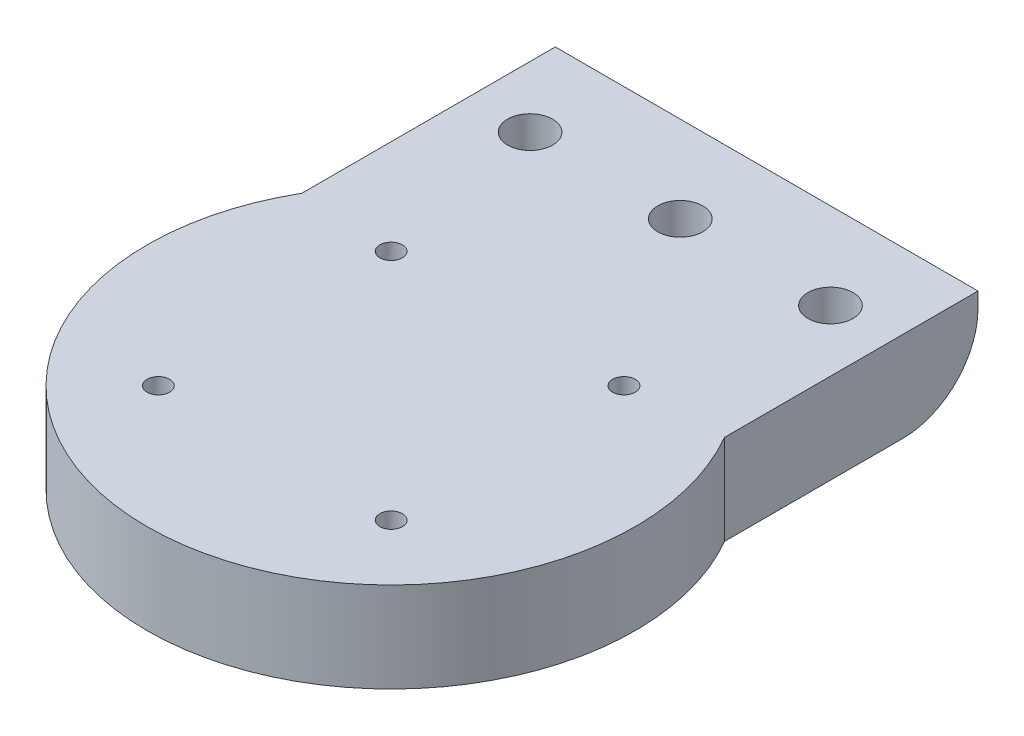
ISO-10303-21;
HEADER;
FILE_DESCRIPTION(('STEP AP214'),'2;1');
FILE_NAME('part.step','',(''),(''),'','','');
FILE_SCHEMA(('AUTOMOTIVE_DESIGN { 1 0 10303 214 1 1 1 1 }'));
ENDSEC;
DATA;
#1=APPLICATION_CONTEXT('core data for automotive mechanical design processes');
#2=APPLICATION_PROTOCOL_DEFINITION('international standard','automotive_design',2000,#1);
#3=PRODUCT_CONTEXT('',#1,'mechanical');
#4=PRODUCT('Part','Part','',(#3));
#5=PRODUCT_RELATED_PRODUCT_CATEGORY('part','',(#4));
#6=PRODUCT_DEFINITION_FORMATION('','',#4);
#7=PRODUCT_DEFINITION_CONTEXT('part definition',#1,'design');
#8=PRODUCT_DEFINITION('design','',#6,#7);
#9=PRODUCT_DEFINITION_SHAPE('','',#8);
#10=(LENGTH_UNIT() NAMED_UNIT(*) SI_UNIT(.MILLI.,.METRE.));
#11=(NAMED_UNIT(*) PLANE_ANGLE_UNIT() SI_UNIT($,.RADIAN.));
#12=(NAMED_UNIT(*) SI_UNIT($,.STERADIAN.) SOLID_ANGLE_UNIT());
#13=UNCERTAINTY_MEASURE_WITH_UNIT(LENGTH_MEASURE(1.E-05),#10,'distance_accuracy_value','');
#14=(GEOMETRIC_REPRESENTATION_CONTEXT(3) GLOBAL_UNCERTAINTY_ASSIGNED_CONTEXT((#13)) GLOBAL_UNIT_ASSIGNED_CONTEXT((#10,
#11,#12)) REPRESENTATION_CONTEXT('',''));
#15=CARTESIAN_POINT('',(0.,0.,0.));
#16=DIRECTION('',(0.,0.,1.));
#17=DIRECTION('',(1.,0.,0.));
#18=AXIS2_PLACEMENT_3D('',#15,#16,#17);
#19=CARTESIAN_POINT('',(0.,12.,0.));
#20=DIRECTION('',(0.,-1.,0.));
#21=DIRECTION('',(0.,0.,-1.));
#22=AXIS2_PLACEMENT_3D('',#19,#20,#21);
#23=CYLINDRICAL_SURFACE('',#22,32.5);
#24=DIRECTION('',(0.,1.,0.));
#25=VECTOR('',#24,1.);
#26=CARTESIAN_POINT('',(28.1458256229942,0.,-16.25));
#27=LINE('',#26,#25);
#28=CARTESIAN_POINT('',(28.1458256229942,0.,-16.25));
#29=VERTEX_POINT('',#28);
#30=CARTESIAN_POINT('',(28.1458256229942,12.,-16.25));
#31=VERTEX_POINT('',#30);
#32=EDGE_CURVE('E135',#29,#31,#27,.T.);
#33=ORIENTED_EDGE('',*,*,#32,.T.);
#34=CARTESIAN_POINT('',(0.,12.,0.));
#35=DIRECTION('',(0.,1.,0.));
#36=DIRECTION('',(0.,0.,1.));
#37=AXIS2_PLACEMENT_3D('',#34,#35,#36);
#38=CIRCLE('',#37,32.5);
#39=CARTESIAN_POINT('',(-28.1458256229944,12.,-16.2499999999998));
#40=VERTEX_POINT('',#39);
#41=EDGE_CURVE('E133',#40,#31,#38,.T.);
#42=ORIENTED_EDGE('',*,*,#41,.F.);
#43=DIRECTION('',(0.,1.,0.));
#44=VECTOR('',#43,1.);
#45=CARTESIAN_POINT('',(-28.1458256229944,0.,-16.2499999999998));
#46=LINE('',#45,#44);
#47=CARTESIAN_POINT('',(-28.1458256229944,0.,-16.2499999999998));
#48=VERTEX_POINT('',#47);
#49=EDGE_CURVE('E114',#48,#40,#46,.T.);
#50=ORIENTED_EDGE('',*,*,#49,.F.);
#51=CARTESIAN_POINT('',(0.,0.,0.));
#52=DIRECTION('',(0.,1.,0.));
#53=DIRECTION('',(0.,0.,1.));
#54=AXIS2_PLACEMENT_3D('',#51,#52,#53);
#55=CIRCLE('',#54,32.5);
#56=EDGE_CURVE('E123',#48,#29,#55,.T.);
#57=ORIENTED_EDGE('',*,*,#56,.T.);
#58=EDGE_LOOP('',(#33,#42,#50,#57));
#59=FACE_BOUND('',#58,.T.);
#60=ADVANCED_FACE('F41',(#59),#23,.T.);
#61=CARTESIAN_POINT('',(15.5,12.,15.5));
#62=DIRECTION('',(0.,-1.,0.));
#63=DIRECTION('',(0.,0.,-1.));
#64=AXIS2_PLACEMENT_3D('',#61,#62,#63);
#65=CYLINDRICAL_SURFACE('',#64,1.5);
#66=CARTESIAN_POINT('',(15.5,12.,15.5));
#67=DIRECTION('',(0.,1.,0.));
#68=DIRECTION('',(0.,0.,1.));
#69=AXIS2_PLACEMENT_3D('',#66,#67,#68);
#70=CIRCLE('',#69,1.5);
#71=CARTESIAN_POINT('',(15.5,12.,17.));
#72=VERTEX_POINT('',#71);
#73=EDGE_CURVE('E161',#72,#72,#70,.T.);
#74=ORIENTED_EDGE('',*,*,#73,.T.);
#75=EDGE_LOOP('',(#74));
#76=FACE_BOUND('',#75,.T.);
#77=CARTESIAN_POINT('',(15.5,0.,15.5));
#78=DIRECTION('',(0.,1.,0.));
#79=DIRECTION('',(0.,0.,1.));
#80=AXIS2_PLACEMENT_3D('',#77,#78,#79);
#81=CIRCLE('',#80,1.5);
#82=CARTESIAN_POINT('',(15.5,0.,17.));
#83=VERTEX_POINT('',#82);
#84=EDGE_CURVE('E130',#83,#83,#81,.T.);
#85=ORIENTED_EDGE('',*,*,#84,.F.);
#86=EDGE_LOOP('',(#85));
#87=FACE_BOUND('',#86,.T.);
#88=ADVANCED_FACE('F309',(#76,#87),#65,.F.);
#89=CARTESIAN_POINT('',(15.5,12.,-15.5));
#90=DIRECTION('',(0.,-1.,0.));
#91=DIRECTION('',(0.,0.,-1.));
#92=AXIS2_PLACEMENT_3D('',#89,#90,#91);
#93=CYLINDRICAL_SURFACE('',#92,1.5);
#94=CARTESIAN_POINT('',(15.5,12.,-15.5));
#95=DIRECTION('',(0.,1.,0.));
#96=DIRECTION('',(0.,0.,1.));
#97=AXIS2_PLACEMENT_3D('',#94,#95,#96);
#98=CIRCLE('',#97,1.5);
#99=CARTESIAN_POINT('',(15.5,12.,-14.));
#100=VERTEX_POINT('',#99);
#101=EDGE_CURVE('E157',#100,#100,#98,.T.);
#102=ORIENTED_EDGE('',*,*,#101,.T.);
#103=EDGE_LOOP('',(#102));
#104=FACE_BOUND('',#103,.T.);
#105=CARTESIAN_POINT('',(15.5,0.,-15.5));
#106=DIRECTION('',(0.,1.,0.));
#107=DIRECTION('',(0.,0.,1.));
#108=AXIS2_PLACEMENT_3D('',#105,#106,#107);
#109=CIRCLE('',#108,1.5);
#110=CARTESIAN_POINT('',(15.5,0.,-14.));
#111=VERTEX_POINT('',#110);
#112=EDGE_CURVE('E175',#111,#111,#109,.T.);
#113=ORIENTED_EDGE('',*,*,#112,.F.);
#114=EDGE_LOOP('',(#113));
#115=FACE_BOUND('',#114,.T.);
#116=ADVANCED_FACE('F312',(#104,#115),#93,.F.);
#117=CARTESIAN_POINT('',(-15.5,12.,-15.5));
#118=DIRECTION('',(0.,-1.,0.));
#119=DIRECTION('',(0.,0.,-1.));
#120=AXIS2_PLACEMENT_3D('',#117,#118,#119);
#121=CYLINDRICAL_SURFACE('',#120,1.5);
#122=CARTESIAN_POINT('',(-15.5,12.,-15.5));
#123=DIRECTION('',(0.,1.,0.));
#124=DIRECTION('',(0.,0.,1.));
#125=AXIS2_PLACEMENT_3D('',#122,#123,#124);
#126=CIRCLE('',#125,1.5);
#127=CARTESIAN_POINT('',(-15.5,12.,-14.));
#128=VERTEX_POINT('',#127);
#129=EDGE_CURVE('E153',#128,#128,#126,.T.);
#130=ORIENTED_EDGE('',*,*,#129,.T.);
#131=EDGE_LOOP('',(#130));
#132=FACE_BOUND('',#131,.T.);
#133=CARTESIAN_POINT('',(-15.5,0.,-15.5));
#134=DIRECTION('',(0.,1.,0.));
#135=DIRECTION('',(0.,0.,1.));
#136=AXIS2_PLACEMENT_3D('',#133,#134,#135);
#137=CIRCLE('',#136,1.5);
#138=CARTESIAN_POINT('',(-15.5,0.,-14.));
#139=VERTEX_POINT('',#138);
#140=EDGE_CURVE('E171',#139,#139,#137,.T.);
#141=ORIENTED_EDGE('',*,*,#140,.F.);
#142=EDGE_LOOP('',(#141));
#143=FACE_BOUND('',#142,.T.);
#144=ADVANCED_FACE('F332',(#132,#143),#121,.F.);
#145=CARTESIAN_POINT('',(-15.5,12.,15.5));
#146=DIRECTION('',(0.,-1.,0.));
#147=DIRECTION('',(0.,0.,-1.));
#148=AXIS2_PLACEMENT_3D('',#145,#146,#147);
#149=CYLINDRICAL_SURFACE('',#148,1.5);
#150=CARTESIAN_POINT('',(-15.5,12.,15.5));
#151=DIRECTION('',(0.,1.,0.));
#152=DIRECTION('',(0.,0.,1.));
#153=AXIS2_PLACEMENT_3D('',#150,#151,#152);
#154=CIRCLE('',#153,1.5);
#155=CARTESIAN_POINT('',(-15.5,12.,17.));
#156=VERTEX_POINT('',#155);
#157=EDGE_CURVE('E129',#156,#156,#154,.T.);
#158=ORIENTED_EDGE('',*,*,#157,.T.);
#159=EDGE_LOOP('',(#158));
#160=FACE_BOUND('',#159,.T.);
#161=CARTESIAN_POINT('',(-15.5,0.,15.5));
#162=DIRECTION('',(0.,1.,0.));
#163=DIRECTION('',(0.,0.,1.));
#164=AXIS2_PLACEMENT_3D('',#161,#162,#163);
#165=CIRCLE('',#164,1.5);
#166=CARTESIAN_POINT('',(-15.5,0.,17.));
#167=VERTEX_POINT('',#166);
#168=EDGE_CURVE('E149',#167,#167,#165,.T.);
#169=ORIENTED_EDGE('',*,*,#168,.F.);
#170=EDGE_LOOP('',(#169));
#171=FACE_BOUND('',#170,.T.);
#172=ADVANCED_FACE('F294',(#160,#171),#149,.F.);
#173=CARTESIAN_POINT('',(0.,12.,0.));
#174=DIRECTION('',(0.,1.,0.));
#175=DIRECTION('',(0.,0.,1.));
#176=AXIS2_PLACEMENT_3D('',#173,#174,#175);
#177=PLANE('',#176);
#178=CARTESIAN_POINT('',(-20.,12.,-38.5));
#179=DIRECTION('',(0.,1.,0.));
#180=DIRECTION('',(0.,0.,1.));
#181=AXIS2_PLACEMENT_3D('',#178,#179,#180);
#182=CIRCLE('',#181,3.);
#183=CARTESIAN_POINT('',(-20.,12.,-35.5));
#184=VERTEX_POINT('',#183);
#185=EDGE_CURVE('E246',#184,#184,#182,.T.);
#186=ORIENTED_EDGE('',*,*,#185,.F.);
#187=EDGE_LOOP('',(#186));
#188=FACE_BOUND('',#187,.T.);
#189=CARTESIAN_POINT('',(0.,12.,-38.5));
#190=DIRECTION('',(0.,1.,0.));
#191=DIRECTION('',(0.,0.,1.));
#192=AXIS2_PLACEMENT_3D('',#189,#190,#191);
#193=CIRCLE('',#192,3.);
#194=CARTESIAN_POINT('',(0.,12.,-35.5));
#195=VERTEX_POINT('',#194);
#196=EDGE_CURVE('E247',#195,#195,#193,.T.);
#197=ORIENTED_EDGE('',*,*,#196,.F.);
#198=EDGE_LOOP('',(#197));
#199=FACE_BOUND('',#198,.T.);
#200=CARTESIAN_POINT('',(20.,12.,-38.5));
#201=DIRECTION('',(0.,1.,0.));
#202=DIRECTION('',(0.,0.,1.));
#203=AXIS2_PLACEMENT_3D('',#200,#201,#202);
#204=CIRCLE('',#203,3.);
#205=CARTESIAN_POINT('',(20.,12.,-35.5));
#206=VERTEX_POINT('',#205);
#207=EDGE_CURVE('E273',#206,#206,#204,.T.);
#208=ORIENTED_EDGE('',*,*,#207,.F.);
#209=EDGE_LOOP('',(#208));
#210=FACE_BOUND('',#209,.T.);
#211=ORIENTED_EDGE('',*,*,#157,.F.);
#212=EDGE_LOOP('',(#211));
#213=FACE_BOUND('',#212,.T.);
#214=ORIENTED_EDGE('',*,*,#129,.F.);
#215=EDGE_LOOP('',(#214));
#216=FACE_BOUND('',#215,.T.);
#217=ORIENTED_EDGE('',*,*,#101,.F.);
#218=EDGE_LOOP('',(#217));
#219=FACE_BOUND('',#218,.T.);
#220=ORIENTED_EDGE('',*,*,#73,.F.);
#221=EDGE_LOOP('',(#220));
#222=FACE_BOUND('',#221,.T.);
#223=ORIENTED_EDGE('',*,*,#41,.T.);
#224=DIRECTION('',(0.,0.,1.));
#225=VECTOR('',#224,1.);
#226=CARTESIAN_POINT('',(28.1458256229942,12.,0.));
#227=LINE('',#226,#225);
#228=CARTESIAN_POINT('',(28.1458256229942,12.,-50.));
#229=VERTEX_POINT('',#228);
#230=EDGE_CURVE('E120',#229,#31,#227,.T.);
#231=ORIENTED_EDGE('',*,*,#230,.F.);
#232=DIRECTION('',(-1.,0.,0.));
#233=VECTOR('',#232,1.);
#234=CARTESIAN_POINT('',(0.,12.,-50.));
#235=LINE('',#234,#233);
#236=CARTESIAN_POINT('',(-28.1458256229944,12.,-50.));
#237=VERTEX_POINT('',#236);
#238=EDGE_CURVE('E260',#229,#237,#235,.T.);
#239=ORIENTED_EDGE('',*,*,#238,.T.);
#240=DIRECTION('',(0.,0.,1.));
#241=VECTOR('',#240,1.);
#242=CARTESIAN_POINT('',(-28.1458256229944,12.,0.));
#243=LINE('',#242,#241);
#244=EDGE_CURVE('E265',#237,#40,#243,.T.);
#245=ORIENTED_EDGE('',*,*,#244,.T.);
#246=EDGE_LOOP('',(#223,#231,#239,#245));
#247=FACE_BOUND('',#246,.T.);
#248=ADVANCED_FACE('F291',(#188,#199,#210,#213,#216,#219,#222,#247),#177,.T.);
#249=CARTESIAN_POINT('',(0.,0.,0.));
#250=DIRECTION('',(0.,1.,0.));
#251=DIRECTION('',(0.,0.,1.));
#252=AXIS2_PLACEMENT_3D('',#249,#250,#251);
#253=PLANE('',#252);
#254=DIRECTION('',(0.,0.,1.));
#255=VECTOR('',#254,1.);
#256=CARTESIAN_POINT('',(-28.1458256229944,0.,0.));
#257=LINE('',#256,#255);
#258=CARTESIAN_POINT('',(-28.1458256229944,0.,-40.));
#259=VERTEX_POINT('',#258);
#260=EDGE_CURVE('E108',#259,#48,#257,.T.);
#261=ORIENTED_EDGE('',*,*,#260,.F.);
#262=DIRECTION('',(-1.,0.,0.));
#263=VECTOR('',#262,1.);
#264=CARTESIAN_POINT('',(28.1458256229942,0.,-40.));
#265=LINE('',#264,#263);
#266=CARTESIAN_POINT('',(-22.5980762113533,0.,-40.));
#267=VERTEX_POINT('',#266);
#268=EDGE_CURVE('E198',#259,#267,#265,.F.);
#269=ORIENTED_EDGE('',*,*,#268,.T.);
#270=CARTESIAN_POINT('',(-20.,0.,-38.5));
#271=DIRECTION('',(0.,1.,0.));
#272=DIRECTION('',(0.,0.,1.));
#273=AXIS2_PLACEMENT_3D('',#270,#271,#272);
#274=CIRCLE('',#273,3.);
#275=CARTESIAN_POINT('',(-17.4019237886467,0.,-40.));
#276=VERTEX_POINT('',#275);
#277=EDGE_CURVE('E270',#267,#276,#274,.T.);
#278=ORIENTED_EDGE('',*,*,#277,.T.);
#279=DIRECTION('',(-1.,0.,0.));
#280=VECTOR('',#279,1.);
#281=CARTESIAN_POINT('',(28.1458256229942,0.,-40.));
#282=LINE('',#281,#280);
#283=CARTESIAN_POINT('',(-2.59807621135335,0.,-40.));
#284=VERTEX_POINT('',#283);
#285=EDGE_CURVE('E195',#276,#284,#282,.F.);
#286=ORIENTED_EDGE('',*,*,#285,.T.);
#287=CARTESIAN_POINT('',(0.,0.,-38.5));
#288=DIRECTION('',(0.,1.,0.));
#289=DIRECTION('',(0.,0.,1.));
#290=AXIS2_PLACEMENT_3D('',#287,#288,#289);
#291=CIRCLE('',#290,3.);
#292=CARTESIAN_POINT('',(2.59807621135329,0.,-40.));
#293=VERTEX_POINT('',#292);
#294=EDGE_CURVE('E241',#284,#293,#291,.T.);
#295=ORIENTED_EDGE('',*,*,#294,.T.);
#296=DIRECTION('',(-1.,0.,0.));
#297=VECTOR('',#296,1.);
#298=CARTESIAN_POINT('',(28.1458256229942,0.,-40.));
#299=LINE('',#298,#297);
#300=CARTESIAN_POINT('',(17.4019237886467,0.,-40.));
#301=VERTEX_POINT('',#300);
#302=EDGE_CURVE('E64',#293,#301,#299,.F.);
#303=ORIENTED_EDGE('',*,*,#302,.T.);
#304=CARTESIAN_POINT('',(20.,0.,-38.5));
#305=DIRECTION('',(0.,1.,0.));
#306=DIRECTION('',(0.,0.,1.));
#307=AXIS2_PLACEMENT_3D('',#304,#305,#306);
#308=CIRCLE('',#307,3.);
#309=CARTESIAN_POINT('',(22.5980762113533,0.,-40.));
#310=VERTEX_POINT('',#309);
#311=EDGE_CURVE('E277',#301,#310,#308,.T.);
#312=ORIENTED_EDGE('',*,*,#311,.T.);
#313=DIRECTION('',(-1.,0.,0.));
#314=VECTOR('',#313,1.);
#315=CARTESIAN_POINT('',(28.1458256229942,0.,-40.));
#316=LINE('',#315,#314);
#317=CARTESIAN_POINT('',(28.1458256229942,0.,-40.));
#318=VERTEX_POINT('',#317);
#319=EDGE_CURVE('E58',#310,#318,#316,.F.);
#320=ORIENTED_EDGE('',*,*,#319,.T.);
#321=DIRECTION('',(0.,0.,1.));
#322=VECTOR('',#321,1.);
#323=CARTESIAN_POINT('',(28.1458256229942,0.,0.));
#324=LINE('',#323,#322);
#325=EDGE_CURVE('E119',#318,#29,#324,.T.);
#326=ORIENTED_EDGE('',*,*,#325,.T.);
#327=ORIENTED_EDGE('',*,*,#56,.F.);
#328=EDGE_LOOP('',(#261,#269,#278,#286,#295,#303,#312,#320,#326,#327));
#329=FACE_BOUND('',#328,.T.);
#330=CARTESIAN_POINT('',(0.,0.,0.));
#331=DIRECTION('',(0.,1.,0.));
#332=DIRECTION('',(0.,0.,1.));
#333=AXIS2_PLACEMENT_3D('',#330,#331,#332);
#334=CIRCLE('',#333,5.);
#335=CARTESIAN_POINT('',(0.,0.,5.));
#336=VERTEX_POINT('',#335);
#337=EDGE_CURVE('E167',#336,#336,#334,.F.);
#338=ORIENTED_EDGE('',*,*,#337,.F.);
#339=EDGE_LOOP('',(#338));
#340=FACE_BOUND('',#339,.T.);
#341=ORIENTED_EDGE('',*,*,#168,.T.);
#342=EDGE_LOOP('',(#341));
#343=FACE_BOUND('',#342,.T.);
#344=ORIENTED_EDGE('',*,*,#140,.T.);
#345=EDGE_LOOP('',(#344));
#346=FACE_BOUND('',#345,.T.);
#347=ORIENTED_EDGE('',*,*,#112,.T.);
#348=EDGE_LOOP('',(#347));
#349=FACE_BOUND('',#348,.T.);
#350=ORIENTED_EDGE('',*,*,#84,.T.);
#351=EDGE_LOOP('',(#350));
#352=FACE_BOUND('',#351,.T.);
#353=ADVANCED_FACE('F124',(#329,#340,#343,#346,#349,#352),#253,.F.);
#354=CARTESIAN_POINT('',(0.,-12.,0.));
#355=DIRECTION('',(0.,1.,0.));
#356=DIRECTION('',(0.,0.,1.));
#357=AXIS2_PLACEMENT_3D('',#354,#355,#356);
#358=CYLINDRICAL_SURFACE('',#357,5.);
#359=CARTESIAN_POINT('',(0.,-12.,0.));
#360=DIRECTION('',(0.,-1.,0.));
#361=DIRECTION('',(0.,0.,-1.));
#362=AXIS2_PLACEMENT_3D('',#359,#360,#361);
#363=CIRCLE('',#362,5.);
#364=CARTESIAN_POINT('',(0.,-12.,-5.));
#365=VERTEX_POINT('',#364);
#366=EDGE_CURVE('E145',#365,#365,#363,.T.);
#367=ORIENTED_EDGE('',*,*,#366,.F.);
#368=EDGE_LOOP('',(#367));
#369=FACE_BOUND('',#368,.T.);
#370=ORIENTED_EDGE('',*,*,#337,.T.);
#371=EDGE_LOOP('',(#370));
#372=FACE_BOUND('',#371,.T.);
#373=ADVANCED_FACE('F317',(#369,#372),#358,.T.);
#374=CARTESIAN_POINT('',(0.,-12.,0.));
#375=DIRECTION('',(0.,-1.,0.));
#376=DIRECTION('',(0.,0.,-1.));
#377=AXIS2_PLACEMENT_3D('',#374,#375,#376);
#378=PLANE('',#377);
#379=ORIENTED_EDGE('',*,*,#366,.T.);
#380=EDGE_LOOP('',(#379));
#381=FACE_BOUND('',#380,.T.);
#382=ADVANCED_FACE('F322',(#381),#378,.T.);
#383=CARTESIAN_POINT('',(0.,0.,-50.));
#384=DIRECTION('',(0.,0.,-1.));
#385=DIRECTION('',(-1.,0.,0.));
#386=AXIS2_PLACEMENT_3D('',#383,#384,#385);
#387=PLANE('',#386);
#388=DIRECTION('',(0.,1.,0.));
#389=VECTOR('',#388,1.);
#390=CARTESIAN_POINT('',(28.1458256229942,0.,-50.));
#391=LINE('',#390,#389);
#392=CARTESIAN_POINT('',(28.1458256229942,10.,-50.));
#393=VERTEX_POINT('',#392);
#394=EDGE_CURVE('E140',#393,#229,#391,.T.);
#395=ORIENTED_EDGE('',*,*,#394,.F.);
#396=DIRECTION('',(-1.,0.,0.));
#397=VECTOR('',#396,1.);
#398=CARTESIAN_POINT('',(-28.1458256229944,10.,-50.));
#399=LINE('',#398,#397);
#400=CARTESIAN_POINT('',(-28.1458256229944,10.,-50.));
#401=VERTEX_POINT('',#400);
#402=EDGE_CURVE('E185',#393,#401,#399,.T.);
#403=ORIENTED_EDGE('',*,*,#402,.T.);
#404=DIRECTION('',(0.,1.,0.));
#405=VECTOR('',#404,1.);
#406=CARTESIAN_POINT('',(-28.1458256229944,0.,-50.));
#407=LINE('',#406,#405);
#408=EDGE_CURVE('E136',#401,#237,#407,.T.);
#409=ORIENTED_EDGE('',*,*,#408,.T.);
#410=ORIENTED_EDGE('',*,*,#238,.F.);
#411=EDGE_LOOP('',(#395,#403,#409,#410));
#412=FACE_BOUND('',#411,.T.);
#413=ADVANCED_FACE('F258',(#412),#387,.T.);
#414=CARTESIAN_POINT('',(28.1458256229942,0.,0.));
#415=DIRECTION('',(-1.,0.,0.));
#416=DIRECTION('',(0.,0.,1.));
#417=AXIS2_PLACEMENT_3D('',#414,#415,#416);
#418=PLANE('',#417);
#419=ORIENTED_EDGE('',*,*,#325,.F.);
#420=CARTESIAN_POINT('',(28.1458256229942,10.,-40.));
#421=DIRECTION('',(-1.,0.,0.));
#422=DIRECTION('',(0.,0.,1.));
#423=AXIS2_PLACEMENT_3D('',#420,#421,#422);
#424=CIRCLE('',#423,10.);
#425=EDGE_CURVE('E11',#318,#393,#424,.F.);
#426=ORIENTED_EDGE('',*,*,#425,.T.);
#427=ORIENTED_EDGE('',*,*,#394,.T.);
#428=ORIENTED_EDGE('',*,*,#230,.T.);
#429=ORIENTED_EDGE('',*,*,#32,.F.);
#430=EDGE_LOOP('',(#419,#426,#427,#428,#429));
#431=FACE_BOUND('',#430,.T.);
#432=ADVANCED_FACE('F229',(#431),#418,.F.);
#433=CARTESIAN_POINT('',(-28.1458256229944,0.,0.));
#434=DIRECTION('',(-1.,0.,0.));
#435=DIRECTION('',(0.,0.,1.));
#436=AXIS2_PLACEMENT_3D('',#433,#434,#435);
#437=PLANE('',#436);
#438=ORIENTED_EDGE('',*,*,#408,.F.);
#439=CARTESIAN_POINT('',(-28.1458256229944,10.,-40.));
#440=DIRECTION('',(-1.,0.,0.));
#441=DIRECTION('',(0.,0.,1.));
#442=AXIS2_PLACEMENT_3D('',#439,#440,#441);
#443=CIRCLE('',#442,10.);
#444=EDGE_CURVE('E116',#401,#259,#443,.T.);
#445=ORIENTED_EDGE('',*,*,#444,.T.);
#446=ORIENTED_EDGE('',*,*,#260,.T.);
#447=ORIENTED_EDGE('',*,*,#49,.T.);
#448=ORIENTED_EDGE('',*,*,#244,.F.);
#449=EDGE_LOOP('',(#438,#445,#446,#447,#448));
#450=FACE_BOUND('',#449,.T.);
#451=ADVANCED_FACE('F111',(#450),#437,.T.);
#452=CARTESIAN_POINT('',(20.,0.,-38.5));
#453=DIRECTION('',(0.,1.,0.));
#454=DIRECTION('',(0.,0.,1.));
#455=AXIS2_PLACEMENT_3D('',#452,#453,#454);
#456=CYLINDRICAL_SURFACE('',#455,3.);
#457=ORIENTED_EDGE('',*,*,#311,.F.);
#458=CARTESIAN_POINT('',(17.4019237886467,0.,-40.));
#459=CARTESIAN_POINT('',(17.4439132206192,-4.33470554000181E-06,-40.0727454244234));
#460=CARTESIAN_POINT('',(17.4889682349274,0.000793764071524826,-40.1437106182615));
#461=CARTESIAN_POINT('',(17.5848427483749,0.00372869231862815,-40.2815867085191));
#462=CARTESIAN_POINT('',(17.6356612031854,0.00586527957249495,-40.3484983360798));
#463=CARTESIAN_POINT('',(17.7426534026047,0.0112083445388363,-40.4777301102951));
#464=CARTESIAN_POINT('',(17.7988212878932,0.0144136610663478,-40.5400551509923));
#465=CARTESIAN_POINT('',(17.9161327605001,0.0216072142468684,-40.6597521294769));
#466=CARTESIAN_POINT('',(17.9772764685009,0.0255954698924209,-40.7171239470604));
#467=CARTESIAN_POINT('',(18.1675501412586,0.0382975006723685,-40.8811998497758));
#468=CARTESIAN_POINT('',(18.3036236257264,0.0477545836090914,-40.9799860713755));
#469=CARTESIAN_POINT('',(18.5902706802221,0.0663590938776867,-41.1534443035857));
#470=CARTESIAN_POINT('',(18.740843745825,0.0755065319668214,-41.2281171526815));
#471=CARTESIAN_POINT('',(19.0537506592934,0.0915991069124973,-41.3518638224346));
#472=CARTESIAN_POINT('',(19.2161708980962,0.0985255503136284,-41.4007224875666));
#473=CARTESIAN_POINT('',(19.5470375022246,0.108634204456047,-41.4704227618021));
#474=CARTESIAN_POINT('',(19.7154840290225,0.111816314791738,-41.4912636196005));
#475=CARTESIAN_POINT('',(20.0519533287215,0.113780247205914,-41.5042277728185));
#476=CARTESIAN_POINT('',(20.2199658061796,0.11260217967471,-41.4966128341369));
#477=CARTESIAN_POINT('',(20.552267290624,0.106171194237423,-41.4534843116564));
#478=CARTESIAN_POINT('',(20.7165567069936,0.100918726606991,-41.4179738106845));
#479=CARTESIAN_POINT('',(21.0363240631018,0.0874171172002457,-41.3202671398429));
#480=CARTESIAN_POINT('',(21.191826469305,0.0791768236277591,-41.258149666879));
#481=CARTESIAN_POINT('',(21.4903798112021,0.0613963355873311,-41.1089509908478));
#482=CARTESIAN_POINT('',(21.6334240364539,0.0518554475811107,-41.0218564412889));
#483=CARTESIAN_POINT('',(21.904647004689,0.0335037872613673,-40.8239724418335));
#484=CARTESIAN_POINT('',(22.0326342669666,0.0247027572851869,-40.712920097204));
#485=CARTESIAN_POINT('',(22.2680448380225,0.0103623713341242,-40.4708771720006));
#486=CARTESIAN_POINT('',(22.3755089729248,0.00481649339726242,-40.339927125764));
#487=CARTESIAN_POINT('',(22.493607126205,0.00136379957964802,-40.1683850829853));
#488=CARTESIAN_POINT('',(22.5154481475471,0.000858404416014348,-40.1352675340282));
#489=CARTESIAN_POINT('',(22.5577737249922,0.000176940264918256,-40.0682336522144));
#490=CARTESIAN_POINT('',(22.578260009479,4.43530494086607E-07,-40.0343184150324));
#491=CARTESIAN_POINT('',(22.5980762113533,0.,-40.));
#492=B_SPLINE_CURVE_WITH_KNOTS('',3,(#458,#459,#460,#461,#462,#463,#464,#465,#466,#467,#468,
#469,#470,#471,#472,#473,#474,#475,#476,#477,#478,#479,#480,#481,#482,#483,#484,#485,#486,#487,
#488,#489,#490,#491),.UNSPECIFIED.,.F.,.F.,(4,2,2,2,2,2,2,2,2,2,2,2,2,2,2,2,4),(0.,
0.25188975965668,0.503733949883985,0.755305395755665,1.00688294500377,1.50956926095571,
2.0122380952997,2.51903298339174,3.02584146105573,3.52799931522281,4.03010168214252,
4.53072909840444,5.03162452477798,5.53832463782599,6.04400603954191,6.16301080872156,
6.28186069862409),.UNSPECIFIED.);
#493=EDGE_CURVE('E51',#301,#310,#492,.T.);
#494=ORIENTED_EDGE('',*,*,#493,.T.);
#495=EDGE_LOOP('',(#457,#494));
#496=FACE_BOUND('',#495,.T.);
#497=ORIENTED_EDGE('',*,*,#207,.T.);
#498=EDGE_LOOP('',(#497));
#499=FACE_BOUND('',#498,.T.);
#500=ADVANCED_FACE('F223',(#496,#499),#456,.F.);
#501=CARTESIAN_POINT('',(0.,0.,-38.5));
#502=DIRECTION('',(0.,1.,0.));
#503=DIRECTION('',(0.,0.,1.));
#504=AXIS2_PLACEMENT_3D('',#501,#502,#503);
#505=CYLINDRICAL_SURFACE('',#504,3.);
#506=ORIENTED_EDGE('',*,*,#294,.F.);
#507=CARTESIAN_POINT('',(-2.59807621135335,0.,-40.));
#508=CARTESIAN_POINT('',(-2.55608677938084,-4.33470554437035E-06,-40.0727454244234));
#509=CARTESIAN_POINT('',(-2.51103176507261,0.000793764071520547,-40.1437106182615));
#510=CARTESIAN_POINT('',(-2.41515725162515,0.00372869231862634,-40.2815867085191));
#511=CARTESIAN_POINT('',(-2.36433879681465,0.00586527957249545,-40.3484983360798));
#512=CARTESIAN_POINT('',(-2.25734659739533,0.0112083445388372,-40.4777301102951));
#513=CARTESIAN_POINT('',(-2.20117871210679,0.0144136610663469,-40.5400551509923));
#514=CARTESIAN_POINT('',(-2.08386723949991,0.0216072142468668,-40.6597521294769));
#515=CARTESIAN_POINT('',(-2.0227235314991,0.0255954698924204,-40.7171239470604));
#516=CARTESIAN_POINT('',(-1.83244985874141,0.0382975006723697,-40.8811998497758));
#517=CARTESIAN_POINT('',(-1.69637637427363,0.047754583609091,-40.9799860713755));
#518=CARTESIAN_POINT('',(-1.40972931977796,0.066359093877685,-41.1534443035857));
#519=CARTESIAN_POINT('',(-1.25915625417506,0.0755065319668197,-41.2281171526815));
#520=CARTESIAN_POINT('',(-0.94624934070658,0.0915991069124974,-41.3518638224346));
#521=CARTESIAN_POINT('',(-0.783829101903845,0.0985255503136303,-41.4007224875666));
#522=CARTESIAN_POINT('',(-0.452962497775431,0.108634204456049,-41.4704227618021));
#523=CARTESIAN_POINT('',(-0.284515970977534,0.111816314791738,-41.4912636196005));
#524=CARTESIAN_POINT('',(0.0519533287215157,0.113780247205914,-41.5042277728186));
#525=CARTESIAN_POINT('',(0.219965806179581,0.112602179674711,-41.4966128341369));
#526=CARTESIAN_POINT('',(0.552267290623968,0.106171194237424,-41.4534843116564));
#527=CARTESIAN_POINT('',(0.716556706993526,0.100918726606989,-41.4179738106845));
#528=CARTESIAN_POINT('',(1.03632406310173,0.087417117200243,-41.3202671398429));
#529=CARTESIAN_POINT('',(1.19182646930497,0.0791768236277576,-41.258149666879));
#530=CARTESIAN_POINT('',(1.4903798112021,0.0613963355873309,-41.1089509908478));
#531=CARTESIAN_POINT('',(1.63342403645387,0.0518554475811108,-41.0218564412889));
#532=CARTESIAN_POINT('',(1.90464700468897,0.0335037872613675,-40.8239724418335));
#533=CARTESIAN_POINT('',(2.03263426696661,0.0247027572851869,-40.712920097204));
#534=CARTESIAN_POINT('',(2.26804483802249,0.0103623713341239,-40.4708771720006));
#535=CARTESIAN_POINT('',(2.37550897292479,0.00481649339726178,-40.339927125764));
#536=CARTESIAN_POINT('',(2.49360712620493,0.00136379957964819,-40.1683850829853));
#537=CARTESIAN_POINT('',(2.51544814754703,0.000858404416014704,-40.1352675340283));
#538=CARTESIAN_POINT('',(2.55777372499221,0.000176940264919142,-40.0682336522144));
#539=CARTESIAN_POINT('',(2.57826000947894,4.43530495291705E-07,-40.0343184150324));
#540=CARTESIAN_POINT('',(2.59807621135329,0.,-40.));
#541=B_SPLINE_CURVE_WITH_KNOTS('',3,(#507,#508,#509,#510,#511,#512,#513,#514,#515,#516,#517,
#518,#519,#520,#521,#522,#523,#524,#525,#526,#527,#528,#529,#530,#531,#532,#533,#534,#535,#536,
#537,#538,#539,#540),.UNSPECIFIED.,.F.,.F.,(4,2,2,2,2,2,2,2,2,2,2,2,2,2,2,2,4),(0.,
0.251889759656687,0.503733949883983,0.755305395755663,1.00688294500377,1.50956926095572,
2.01223809529971,2.51903298339175,3.02584146105574,3.52799931522282,4.03010168214253,
4.53072909840444,5.03162452477798,5.53832463782599,6.04400603954191,6.16301080872156,
6.2818606986241),.UNSPECIFIED.);
#542=EDGE_CURVE('E209',#284,#293,#541,.T.);
#543=ORIENTED_EDGE('',*,*,#542,.T.);
#544=EDGE_LOOP('',(#506,#543));
#545=FACE_BOUND('',#544,.T.);
#546=ORIENTED_EDGE('',*,*,#196,.T.);
#547=EDGE_LOOP('',(#546));
#548=FACE_BOUND('',#547,.T.);
#549=ADVANCED_FACE('F218',(#545,#548),#505,.F.);
#550=CARTESIAN_POINT('',(-20.,0.,-38.5));
#551=DIRECTION('',(0.,1.,0.));
#552=DIRECTION('',(0.,0.,1.));
#553=AXIS2_PLACEMENT_3D('',#550,#551,#552);
#554=CYLINDRICAL_SURFACE('',#553,3.);
#555=ORIENTED_EDGE('',*,*,#277,.F.);
#556=CARTESIAN_POINT('',(-22.5980762113533,0.,-40.));
#557=CARTESIAN_POINT('',(-22.5560867793808,-4.33470553996743E-06,-40.0727454244234));
#558=CARTESIAN_POINT('',(-22.5110317650726,0.000793764071524879,-40.1437106182615));
#559=CARTESIAN_POINT('',(-22.4151572516251,0.00372869231862822,-40.2815867085191));
#560=CARTESIAN_POINT('',(-22.3643387968146,0.00586527957249502,-40.3484983360798));
#561=CARTESIAN_POINT('',(-22.2573465973953,0.0112083445388364,-40.4777301102951));
#562=CARTESIAN_POINT('',(-22.2011787121068,0.0144136610663479,-40.5400551509923));
#563=CARTESIAN_POINT('',(-22.0838672394999,0.0216072142468684,-40.6597521294769));
#564=CARTESIAN_POINT('',(-22.0227235314991,0.0255954698924209,-40.7171239470604));
#565=CARTESIAN_POINT('',(-21.8324498587414,0.0382975006723685,-40.8811998497758));
#566=CARTESIAN_POINT('',(-21.6963763742736,0.0477545836090914,-40.9799860713755));
#567=CARTESIAN_POINT('',(-21.4097293197779,0.0663590938776867,-41.1534443035857));
#568=CARTESIAN_POINT('',(-21.259156254175,0.0755065319668214,-41.2281171526815));
#569=CARTESIAN_POINT('',(-20.9462493407066,0.0915991069124973,-41.3518638224346));
#570=CARTESIAN_POINT('',(-20.7838291019038,0.0985255503136284,-41.4007224875666));
#571=CARTESIAN_POINT('',(-20.4529624977754,0.108634204456047,-41.4704227618021));
#572=CARTESIAN_POINT('',(-20.2845159709775,0.111816314791738,-41.4912636196005));
#573=CARTESIAN_POINT('',(-19.9480466712785,0.113780247205914,-41.5042277728185));
#574=CARTESIAN_POINT('',(-19.7800341938204,0.11260217967471,-41.4966128341369));
#575=CARTESIAN_POINT('',(-19.447732709376,0.106171194237423,-41.4534843116564));
#576=CARTESIAN_POINT('',(-19.2834432930064,0.100918726606991,-41.4179738106845));
#577=CARTESIAN_POINT('',(-18.9636759368982,0.0874171172002457,-41.3202671398429));
#578=CARTESIAN_POINT('',(-18.808173530695,0.0791768236277591,-41.258149666879));
#579=CARTESIAN_POINT('',(-18.5096201887979,0.0613963355873311,-41.1089509908478));
#580=CARTESIAN_POINT('',(-18.3665759635461,0.0518554475811107,-41.0218564412889));
#581=CARTESIAN_POINT('',(-18.095352995311,0.0335037872613673,-40.8239724418335));
#582=CARTESIAN_POINT('',(-17.9673657330334,0.0247027572851869,-40.712920097204));
#583=CARTESIAN_POINT('',(-17.7319551619775,0.0103623713341242,-40.4708771720006));
#584=CARTESIAN_POINT('',(-17.6244910270752,0.00481649339726242,-40.339927125764));
#585=CARTESIAN_POINT('',(-17.506392873795,0.00136379957964802,-40.1683850829853));
#586=CARTESIAN_POINT('',(-17.4845518524529,0.000858404416014348,-40.1352675340282));
#587=CARTESIAN_POINT('',(-17.4422262750078,0.000176940264918256,-40.0682336522144));
#588=CARTESIAN_POINT('',(-17.421739990521,4.43530494086607E-07,-40.0343184150324));
#589=CARTESIAN_POINT('',(-17.4019237886467,0.,-40.));
#590=B_SPLINE_CURVE_WITH_KNOTS('',3,(#556,#557,#558,#559,#560,#561,#562,#563,#564,#565,#566,
#567,#568,#569,#570,#571,#572,#573,#574,#575,#576,#577,#578,#579,#580,#581,#582,#583,#584,#585,
#586,#587,#588,#589),.UNSPECIFIED.,.F.,.F.,(4,2,2,2,2,2,2,2,2,2,2,2,2,2,2,2,4),(0.,
0.25188975965668,0.503733949883985,0.755305395755665,1.00688294500377,1.50956926095571,
2.0122380952997,2.51903298339174,3.02584146105573,3.52799931522281,4.03010168214252,
4.53072909840444,5.03162452477798,5.53832463782599,6.04400603954191,6.16301080872156,
6.28186069862409),.UNSPECIFIED.);
#591=EDGE_CURVE('E201',#267,#276,#590,.T.);
#592=ORIENTED_EDGE('',*,*,#591,.T.);
#593=EDGE_LOOP('',(#555,#592));
#594=FACE_BOUND('',#593,.T.);
#595=ORIENTED_EDGE('',*,*,#185,.T.);
#596=EDGE_LOOP('',(#595));
#597=FACE_BOUND('',#596,.T.);
#598=ADVANCED_FACE('F215',(#594,#597),#554,.F.);
#599=CARTESIAN_POINT('',(0.,10.,-40.));
#600=DIRECTION('',(1.,0.,0.));
#601=DIRECTION('',(0.,0.,-1.));
#602=AXIS2_PLACEMENT_3D('',#599,#600,#601);
#603=CYLINDRICAL_SURFACE('',#602,10.);
#604=ORIENTED_EDGE('',*,*,#591,.F.);
#605=ORIENTED_EDGE('',*,*,#268,.F.);
#606=ORIENTED_EDGE('',*,*,#444,.F.);
#607=ORIENTED_EDGE('',*,*,#402,.F.);
#608=ORIENTED_EDGE('',*,*,#425,.F.);
#609=ORIENTED_EDGE('',*,*,#319,.F.);
#610=ORIENTED_EDGE('',*,*,#493,.F.);
#611=ORIENTED_EDGE('',*,*,#302,.F.);
#612=ORIENTED_EDGE('',*,*,#542,.F.);
#613=ORIENTED_EDGE('',*,*,#285,.F.);
#614=EDGE_LOOP('',(#604,#605,#606,#607,#608,#609,#610,#611,#612,#613));
#615=FACE_BOUND('',#614,.T.);
#616=ADVANCED_FACE('F43',(#615),#603,.T.);
#617=CLOSED_SHELL('',(#60,#88,#116,#144,#172,#248,#353,#373,#382,#413,#432,#451,#500,#549,#598,#616));
#618=MANIFOLD_SOLID_BREP('B2',#617);
#619=ADVANCED_BREP_SHAPE_REPRESENTATION('',(#18,#618),#14);
#620=SHAPE_DEFINITION_REPRESENTATION(#9,#619);
ENDSEC;
END-ISO-10303-21;
